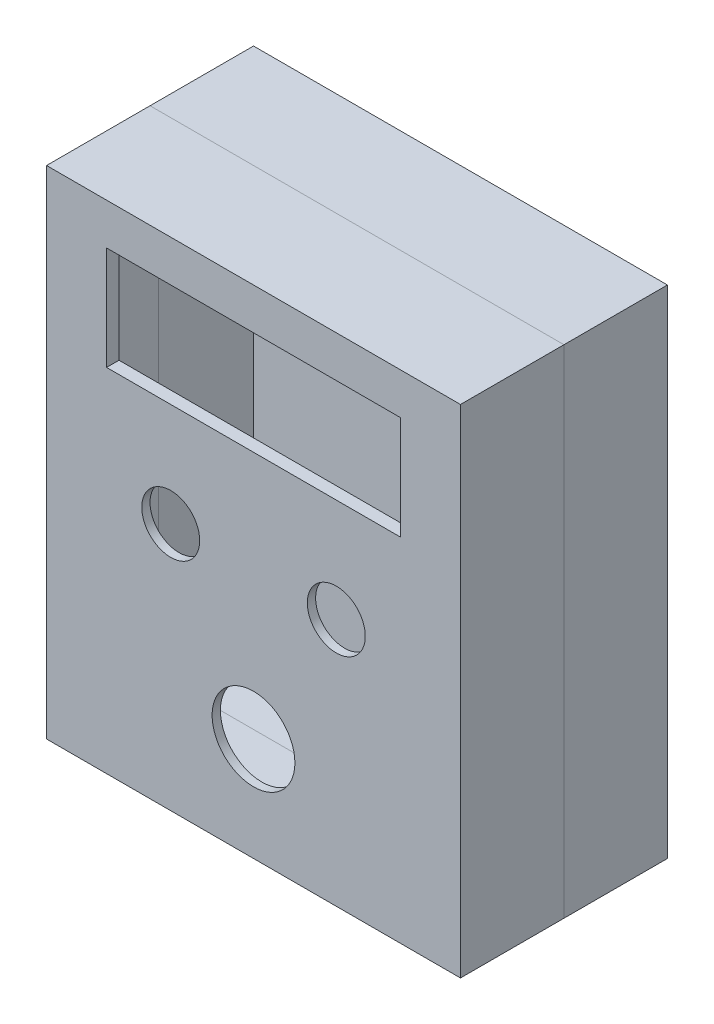
ISO-10303-21;
HEADER;
FILE_DESCRIPTION(('STEP AP214'),'2;1');
FILE_NAME('part.step','',(''),(''),'','','');
FILE_SCHEMA(('AUTOMOTIVE_DESIGN { 1 0 10303 214 1 1 1 1 }'));
ENDSEC;
DATA;
#1=APPLICATION_CONTEXT('core data for automotive mechanical design processes');
#2=APPLICATION_PROTOCOL_DEFINITION('international standard','automotive_design',2000,#1);
#3=PRODUCT_CONTEXT('',#1,'mechanical');
#4=PRODUCT('Part','Part','',(#3));
#5=PRODUCT_RELATED_PRODUCT_CATEGORY('part','',(#4));
#6=PRODUCT_DEFINITION_FORMATION('','',#4);
#7=PRODUCT_DEFINITION_CONTEXT('part definition',#1,'design');
#8=PRODUCT_DEFINITION('design','',#6,#7);
#9=PRODUCT_DEFINITION_SHAPE('','',#8);
#10=(LENGTH_UNIT() NAMED_UNIT(*) SI_UNIT(.MILLI.,.METRE.));
#11=(NAMED_UNIT(*) PLANE_ANGLE_UNIT() SI_UNIT($,.RADIAN.));
#12=(NAMED_UNIT(*) SI_UNIT($,.STERADIAN.) SOLID_ANGLE_UNIT());
#13=UNCERTAINTY_MEASURE_WITH_UNIT(LENGTH_MEASURE(1.E-05),#10,'distance_accuracy_value','');
#14=(GEOMETRIC_REPRESENTATION_CONTEXT(3) GLOBAL_UNCERTAINTY_ASSIGNED_CONTEXT((#13)) GLOBAL_UNIT_ASSIGNED_CONTEXT((#10,
#11,#12)) REPRESENTATION_CONTEXT('',''));
#15=CARTESIAN_POINT('',(0.,0.,0.));
#16=DIRECTION('',(0.,0.,1.));
#17=DIRECTION('',(1.,0.,0.));
#18=AXIS2_PLACEMENT_3D('',#15,#16,#17);
#19=CARTESIAN_POINT('',(0.,0.,0.));
#20=DIRECTION('',(0.,0.,1.));
#21=DIRECTION('',(1.,0.,0.));
#22=AXIS2_PLACEMENT_3D('',#19,#20,#21);
#23=PLANE('',#22);
#24=DIRECTION('',(1.,0.,0.));
#25=VECTOR('',#24,1.);
#26=CARTESIAN_POINT('',(100.,-60.,0.));
#27=LINE('',#26,#25);
#28=CARTESIAN_POINT('',(0.,-60.,0.));
#29=VERTEX_POINT('',#28);
#30=CARTESIAN_POINT('',(100.,-60.,0.));
#31=VERTEX_POINT('',#30);
#32=EDGE_CURVE('E170',#29,#31,#27,.T.);
#33=ORIENTED_EDGE('',*,*,#32,.T.);
#34=DIRECTION('',(0.,1.,0.));
#35=VECTOR('',#34,1.);
#36=CARTESIAN_POINT('',(100.,0.,0.));
#37=LINE('',#36,#35);
#38=CARTESIAN_POINT('',(100.,60.,0.));
#39=VERTEX_POINT('',#38);
#40=EDGE_CURVE('E166',#31,#39,#37,.T.);
#41=ORIENTED_EDGE('',*,*,#40,.T.);
#42=DIRECTION('',(-1.,0.,0.));
#43=VECTOR('',#42,1.);
#44=CARTESIAN_POINT('',(100.,60.,0.));
#45=LINE('',#44,#43);
#46=CARTESIAN_POINT('',(0.,60.,0.));
#47=VERTEX_POINT('',#46);
#48=EDGE_CURVE('E239',#39,#47,#45,.T.);
#49=ORIENTED_EDGE('',*,*,#48,.T.);
#50=DIRECTION('',(0.,1.,0.));
#51=VECTOR('',#50,1.);
#52=CARTESIAN_POINT('',(0.,0.,0.));
#53=LINE('',#52,#51);
#54=EDGE_CURVE('E161',#29,#47,#53,.T.);
#55=ORIENTED_EDGE('',*,*,#54,.F.);
#56=EDGE_LOOP('',(#33,#41,#49,#55));
#57=FACE_BOUND('',#56,.T.);
#58=DIRECTION('',(0.,1.,0.));
#59=VECTOR('',#58,1.);
#60=CARTESIAN_POINT('',(98.,0.,0.));
#61=LINE('',#60,#59);
#62=CARTESIAN_POINT('',(98.,-58.,0.));
#63=VERTEX_POINT('',#62);
#64=CARTESIAN_POINT('',(98.,58.,0.));
#65=VERTEX_POINT('',#64);
#66=EDGE_CURVE('E231',#63,#65,#61,.T.);
#67=ORIENTED_EDGE('',*,*,#66,.F.);
#68=DIRECTION('',(1.,0.,0.));
#69=VECTOR('',#68,1.);
#70=CARTESIAN_POINT('',(100.,-58.,0.));
#71=LINE('',#70,#69);
#72=CARTESIAN_POINT('',(2.,-58.,0.));
#73=VERTEX_POINT('',#72);
#74=EDGE_CURVE('E160',#73,#63,#71,.T.);
#75=ORIENTED_EDGE('',*,*,#74,.F.);
#76=DIRECTION('',(0.,1.,0.));
#77=VECTOR('',#76,1.);
#78=CARTESIAN_POINT('',(2.,0.,0.));
#79=LINE('',#78,#77);
#80=CARTESIAN_POINT('',(2.,58.,0.));
#81=VERTEX_POINT('',#80);
#82=EDGE_CURVE('E145',#73,#81,#79,.T.);
#83=ORIENTED_EDGE('',*,*,#82,.T.);
#84=DIRECTION('',(-1.,0.,0.));
#85=VECTOR('',#84,1.);
#86=CARTESIAN_POINT('',(100.,58.,0.));
#87=LINE('',#86,#85);
#88=EDGE_CURVE('E155',#65,#81,#87,.T.);
#89=ORIENTED_EDGE('',*,*,#88,.F.);
#90=EDGE_LOOP('',(#67,#75,#83,#89));
#91=FACE_BOUND('',#90,.T.);
#92=ADVANCED_FACE('F50',(#57,#91),#23,.T.);
#93=CARTESIAN_POINT('',(100.,60.,25.));
#94=DIRECTION('',(0.,-1.,0.));
#95=DIRECTION('',(0.,0.,-1.));
#96=AXIS2_PLACEMENT_3D('',#93,#94,#95);
#97=PLANE('',#96);
#98=ORIENTED_EDGE('',*,*,#48,.F.);
#99=DIRECTION('',(0.,0.,1.));
#100=VECTOR('',#99,1.);
#101=CARTESIAN_POINT('',(100.,60.,25.));
#102=LINE('',#101,#100);
#103=CARTESIAN_POINT('',(100.,60.,-25.));
#104=VERTEX_POINT('',#103);
#105=EDGE_CURVE('E177',#104,#39,#102,.T.);
#106=ORIENTED_EDGE('',*,*,#105,.F.);
#107=DIRECTION('',(-1.,0.,0.));
#108=VECTOR('',#107,1.);
#109=CARTESIAN_POINT('',(100.,60.,-25.));
#110=LINE('',#109,#108);
#111=CARTESIAN_POINT('',(0.,60.,-25.));
#112=VERTEX_POINT('',#111);
#113=EDGE_CURVE('E258',#104,#112,#110,.T.);
#114=ORIENTED_EDGE('',*,*,#113,.T.);
#115=DIRECTION('',(0.,0.,1.));
#116=VECTOR('',#115,1.);
#117=CARTESIAN_POINT('',(0.,60.,25.));
#118=LINE('',#117,#116);
#119=EDGE_CURVE('E185',#112,#47,#118,.T.);
#120=ORIENTED_EDGE('',*,*,#119,.T.);
#121=EDGE_LOOP('',(#98,#106,#114,#120));
#122=FACE_BOUND('',#121,.T.);
#123=ADVANCED_FACE('F257',(#122),#97,.F.);
#124=CARTESIAN_POINT('',(100.,-60.,25.));
#125=DIRECTION('',(0.,1.,0.));
#126=DIRECTION('',(0.,0.,1.));
#127=AXIS2_PLACEMENT_3D('',#124,#125,#126);
#128=PLANE('',#127);
#129=DIRECTION('',(-1.,0.,0.));
#130=VECTOR('',#129,1.);
#131=CARTESIAN_POINT('',(9.99999999999999,-60.,-11.));
#132=LINE('',#131,#130);
#133=CARTESIAN_POINT('',(90.,-60.,-11.));
#134=VERTEX_POINT('',#133);
#135=CARTESIAN_POINT('',(9.99999999999999,-60.,-11.));
#136=VERTEX_POINT('',#135);
#137=EDGE_CURVE('E60',#134,#136,#132,.T.);
#138=ORIENTED_EDGE('',*,*,#137,.F.);
#139=DIRECTION('',(0.,0.,1.));
#140=VECTOR('',#139,1.);
#141=CARTESIAN_POINT('',(90.,-60.,-11.));
#142=LINE('',#141,#140);
#143=CARTESIAN_POINT('',(90.,-60.,-21.));
#144=VERTEX_POINT('',#143);
#145=EDGE_CURVE('E12',#144,#134,#142,.T.);
#146=ORIENTED_EDGE('',*,*,#145,.F.);
#147=DIRECTION('',(1.,0.,0.));
#148=VECTOR('',#147,1.);
#149=CARTESIAN_POINT('',(10.,-60.,-21.));
#150=LINE('',#149,#148);
#151=CARTESIAN_POINT('',(10.,-60.,-21.));
#152=VERTEX_POINT('',#151);
#153=EDGE_CURVE('E217',#152,#144,#150,.T.);
#154=ORIENTED_EDGE('',*,*,#153,.F.);
#155=DIRECTION('',(0.,0.,-1.));
#156=VECTOR('',#155,1.);
#157=CARTESIAN_POINT('',(9.99999999999999,-60.,-11.));
#158=LINE('',#157,#156);
#159=EDGE_CURVE('E226',#136,#152,#158,.T.);
#160=ORIENTED_EDGE('',*,*,#159,.F.);
#161=EDGE_LOOP('',(#138,#146,#154,#160));
#162=FACE_BOUND('',#161,.T.);
#163=ORIENTED_EDGE('',*,*,#32,.F.);
#164=DIRECTION('',(0.,0.,-1.));
#165=VECTOR('',#164,1.);
#166=CARTESIAN_POINT('',(0.,-60.,25.));
#167=LINE('',#166,#165);
#168=CARTESIAN_POINT('',(0.,-60.,-25.));
#169=VERTEX_POINT('',#168);
#170=EDGE_CURVE('E182',#29,#169,#167,.T.);
#171=ORIENTED_EDGE('',*,*,#170,.T.);
#172=DIRECTION('',(-1.,0.,0.));
#173=VECTOR('',#172,1.);
#174=CARTESIAN_POINT('',(100.,-60.,-25.));
#175=LINE('',#174,#173);
#176=CARTESIAN_POINT('',(100.,-60.,-25.));
#177=VERTEX_POINT('',#176);
#178=EDGE_CURVE('E178',#177,#169,#175,.T.);
#179=ORIENTED_EDGE('',*,*,#178,.F.);
#180=DIRECTION('',(0.,0.,-1.));
#181=VECTOR('',#180,1.);
#182=CARTESIAN_POINT('',(100.,-60.,25.));
#183=LINE('',#182,#181);
#184=EDGE_CURVE('E174',#31,#177,#183,.T.);
#185=ORIENTED_EDGE('',*,*,#184,.F.);
#186=EDGE_LOOP('',(#163,#171,#179,#185));
#187=FACE_BOUND('',#186,.T.);
#188=ADVANCED_FACE('F264',(#162,#187),#128,.F.);
#189=CARTESIAN_POINT('',(100.,0.,0.));
#190=DIRECTION('',(-1.,0.,0.));
#191=DIRECTION('',(0.,0.,1.));
#192=AXIS2_PLACEMENT_3D('',#189,#190,#191);
#193=PLANE('',#192);
#194=ORIENTED_EDGE('',*,*,#40,.F.);
#195=ORIENTED_EDGE('',*,*,#184,.T.);
#196=DIRECTION('',(0.,1.,0.));
#197=VECTOR('',#196,1.);
#198=CARTESIAN_POINT('',(100.,-60.,-25.));
#199=LINE('',#198,#197);
#200=EDGE_CURVE('E181',#177,#104,#199,.T.);
#201=ORIENTED_EDGE('',*,*,#200,.T.);
#202=ORIENTED_EDGE('',*,*,#105,.T.);
#203=EDGE_LOOP('',(#194,#195,#201,#202));
#204=FACE_BOUND('',#203,.T.);
#205=ADVANCED_FACE('F52',(#204),#193,.F.);
#206=CARTESIAN_POINT('',(0.,0.,0.));
#207=DIRECTION('',(-1.,0.,0.));
#208=DIRECTION('',(0.,0.,1.));
#209=AXIS2_PLACEMENT_3D('',#206,#207,#208);
#210=PLANE('',#209);
#211=ORIENTED_EDGE('',*,*,#170,.F.);
#212=ORIENTED_EDGE('',*,*,#54,.T.);
#213=ORIENTED_EDGE('',*,*,#119,.F.);
#214=DIRECTION('',(0.,1.,0.));
#215=VECTOR('',#214,1.);
#216=CARTESIAN_POINT('',(0.,-60.,-25.));
#217=LINE('',#216,#215);
#218=EDGE_CURVE('E189',#169,#112,#217,.T.);
#219=ORIENTED_EDGE('',*,*,#218,.F.);
#220=EDGE_LOOP('',(#211,#212,#213,#219));
#221=FACE_BOUND('',#220,.T.);
#222=ADVANCED_FACE('F262',(#221),#210,.T.);
#223=CARTESIAN_POINT('',(100.,58.,25.));
#224=DIRECTION('',(0.,-1.,0.));
#225=DIRECTION('',(0.,0.,-1.));
#226=AXIS2_PLACEMENT_3D('',#223,#224,#225);
#227=PLANE('',#226);
#228=DIRECTION('',(0.,0.,1.));
#229=VECTOR('',#228,1.);
#230=CARTESIAN_POINT('',(98.,58.,0.));
#231=LINE('',#230,#229);
#232=CARTESIAN_POINT('',(98.,58.,-23.));
#233=VERTEX_POINT('',#232);
#234=EDGE_CURVE('E157',#233,#65,#231,.T.);
#235=ORIENTED_EDGE('',*,*,#234,.T.);
#236=ORIENTED_EDGE('',*,*,#88,.T.);
#237=DIRECTION('',(0.,0.,1.));
#238=VECTOR('',#237,1.);
#239=CARTESIAN_POINT('',(2.,58.,0.));
#240=LINE('',#239,#238);
#241=CARTESIAN_POINT('',(2.,58.,-23.));
#242=VERTEX_POINT('',#241);
#243=EDGE_CURVE('E54',#242,#81,#240,.T.);
#244=ORIENTED_EDGE('',*,*,#243,.F.);
#245=DIRECTION('',(-1.,0.,0.));
#246=VECTOR('',#245,1.);
#247=CARTESIAN_POINT('',(100.,58.,-23.));
#248=LINE('',#247,#246);
#249=EDGE_CURVE('E207',#233,#242,#248,.T.);
#250=ORIENTED_EDGE('',*,*,#249,.F.);
#251=EDGE_LOOP('',(#235,#236,#244,#250));
#252=FACE_BOUND('',#251,.T.);
#253=ADVANCED_FACE('F156',(#252),#227,.T.);
#254=CARTESIAN_POINT('',(100.,-58.,25.));
#255=DIRECTION('',(0.,1.,0.));
#256=DIRECTION('',(0.,0.,1.));
#257=AXIS2_PLACEMENT_3D('',#254,#255,#256);
#258=PLANE('',#257);
#259=DIRECTION('',(0.,0.,-1.));
#260=VECTOR('',#259,1.);
#261=CARTESIAN_POINT('',(90.,-58.,25.));
#262=LINE('',#261,#260);
#263=CARTESIAN_POINT('',(90.,-58.,-11.));
#264=VERTEX_POINT('',#263);
#265=CARTESIAN_POINT('',(90.,-58.,-21.));
#266=VERTEX_POINT('',#265);
#267=EDGE_CURVE('E234',#264,#266,#262,.T.);
#268=ORIENTED_EDGE('',*,*,#267,.F.);
#269=DIRECTION('',(1.,0.,0.));
#270=VECTOR('',#269,1.);
#271=CARTESIAN_POINT('',(100.,-58.,-11.));
#272=LINE('',#271,#270);
#273=CARTESIAN_POINT('',(9.99999999999999,-58.,-11.));
#274=VERTEX_POINT('',#273);
#275=EDGE_CURVE('E270',#274,#264,#272,.T.);
#276=ORIENTED_EDGE('',*,*,#275,.F.);
#277=DIRECTION('',(0.,0.,1.));
#278=VECTOR('',#277,1.);
#279=CARTESIAN_POINT('',(9.99999999999999,-58.,25.));
#280=LINE('',#279,#278);
#281=CARTESIAN_POINT('',(10.,-58.,-21.));
#282=VERTEX_POINT('',#281);
#283=EDGE_CURVE('E415',#282,#274,#280,.T.);
#284=ORIENTED_EDGE('',*,*,#283,.F.);
#285=DIRECTION('',(-1.,0.,0.));
#286=VECTOR('',#285,1.);
#287=CARTESIAN_POINT('',(100.,-58.,-21.));
#288=LINE('',#287,#286);
#289=EDGE_CURVE('E409',#266,#282,#288,.T.);
#290=ORIENTED_EDGE('',*,*,#289,.F.);
#291=EDGE_LOOP('',(#268,#276,#284,#290));
#292=FACE_BOUND('',#291,.T.);
#293=DIRECTION('',(0.,0.,-1.));
#294=VECTOR('',#293,1.);
#295=CARTESIAN_POINT('',(2.,-58.,0.));
#296=LINE('',#295,#294);
#297=CARTESIAN_POINT('',(2.,-58.,-23.));
#298=VERTEX_POINT('',#297);
#299=EDGE_CURVE('E152',#73,#298,#296,.T.);
#300=ORIENTED_EDGE('',*,*,#299,.F.);
#301=ORIENTED_EDGE('',*,*,#74,.T.);
#302=DIRECTION('',(0.,0.,-1.));
#303=VECTOR('',#302,1.);
#304=CARTESIAN_POINT('',(98.,-58.,0.));
#305=LINE('',#304,#303);
#306=CARTESIAN_POINT('',(98.,-58.,-23.));
#307=VERTEX_POINT('',#306);
#308=EDGE_CURVE('E190',#63,#307,#305,.T.);
#309=ORIENTED_EDGE('',*,*,#308,.T.);
#310=DIRECTION('',(-1.,0.,0.));
#311=VECTOR('',#310,1.);
#312=CARTESIAN_POINT('',(100.,-58.,-23.));
#313=LINE('',#312,#311);
#314=EDGE_CURVE('E193',#307,#298,#313,.T.);
#315=ORIENTED_EDGE('',*,*,#314,.T.);
#316=EDGE_LOOP('',(#300,#301,#309,#315));
#317=FACE_BOUND('',#316,.T.);
#318=ADVANCED_FACE('F278',(#292,#317),#258,.T.);
#319=CARTESIAN_POINT('',(98.,0.,0.));
#320=DIRECTION('',(-1.,0.,0.));
#321=DIRECTION('',(0.,0.,1.));
#322=AXIS2_PLACEMENT_3D('',#319,#320,#321);
#323=PLANE('',#322);
#324=ORIENTED_EDGE('',*,*,#308,.F.);
#325=ORIENTED_EDGE('',*,*,#66,.T.);
#326=ORIENTED_EDGE('',*,*,#234,.F.);
#327=DIRECTION('',(0.,1.,0.));
#328=VECTOR('',#327,1.);
#329=CARTESIAN_POINT('',(98.,0.,-23.));
#330=LINE('',#329,#328);
#331=EDGE_CURVE('E195',#307,#233,#330,.T.);
#332=ORIENTED_EDGE('',*,*,#331,.F.);
#333=EDGE_LOOP('',(#324,#325,#326,#332));
#334=FACE_BOUND('',#333,.T.);
#335=ADVANCED_FACE('F303',(#334),#323,.T.);
#336=CARTESIAN_POINT('',(2.,0.,0.));
#337=DIRECTION('',(-1.,0.,0.));
#338=DIRECTION('',(0.,0.,1.));
#339=AXIS2_PLACEMENT_3D('',#336,#337,#338);
#340=PLANE('',#339);
#341=ORIENTED_EDGE('',*,*,#82,.F.);
#342=ORIENTED_EDGE('',*,*,#299,.T.);
#343=DIRECTION('',(0.,1.,0.));
#344=VECTOR('',#343,1.);
#345=CARTESIAN_POINT('',(2.,0.,-23.));
#346=LINE('',#345,#344);
#347=EDGE_CURVE('E147',#298,#242,#346,.T.);
#348=ORIENTED_EDGE('',*,*,#347,.T.);
#349=ORIENTED_EDGE('',*,*,#243,.T.);
#350=EDGE_LOOP('',(#341,#342,#348,#349));
#351=FACE_BOUND('',#350,.T.);
#352=ADVANCED_FACE('F143',(#351),#340,.F.);
#353=CARTESIAN_POINT('',(100.,-60.,-25.));
#354=DIRECTION('',(0.,0.,1.));
#355=DIRECTION('',(1.,0.,0.));
#356=AXIS2_PLACEMENT_3D('',#353,#354,#355);
#357=PLANE('',#356);
#358=ORIENTED_EDGE('',*,*,#218,.T.);
#359=ORIENTED_EDGE('',*,*,#113,.F.);
#360=ORIENTED_EDGE('',*,*,#200,.F.);
#361=ORIENTED_EDGE('',*,*,#178,.T.);
#362=EDGE_LOOP('',(#358,#359,#360,#361));
#363=FACE_BOUND('',#362,.T.);
#364=ADVANCED_FACE('F266',(#363),#357,.F.);
#365=CARTESIAN_POINT('',(100.,-60.,-23.));
#366=DIRECTION('',(0.,0.,1.));
#367=DIRECTION('',(1.,0.,0.));
#368=AXIS2_PLACEMENT_3D('',#365,#366,#367);
#369=PLANE('',#368);
#370=ORIENTED_EDGE('',*,*,#347,.F.);
#371=ORIENTED_EDGE('',*,*,#314,.F.);
#372=ORIENTED_EDGE('',*,*,#331,.T.);
#373=ORIENTED_EDGE('',*,*,#249,.T.);
#374=EDGE_LOOP('',(#370,#371,#372,#373));
#375=FACE_BOUND('',#374,.T.);
#376=ADVANCED_FACE('F280',(#375),#369,.T.);
#377=CARTESIAN_POINT('',(90.,-57.,-11.));
#378=DIRECTION('',(1.,0.,0.));
#379=DIRECTION('',(0.,0.,-1.));
#380=AXIS2_PLACEMENT_3D('',#377,#378,#379);
#381=PLANE('',#380);
#382=ORIENTED_EDGE('',*,*,#267,.T.);
#383=DIRECTION('',(0.,-1.,0.));
#384=VECTOR('',#383,1.);
#385=CARTESIAN_POINT('',(90.,-57.,-21.));
#386=LINE('',#385,#384);
#387=EDGE_CURVE('E212',#266,#144,#386,.T.);
#388=ORIENTED_EDGE('',*,*,#387,.T.);
#389=ORIENTED_EDGE('',*,*,#145,.T.);
#390=DIRECTION('',(0.,-1.,0.));
#391=VECTOR('',#390,1.);
#392=CARTESIAN_POINT('',(90.,-57.,-11.));
#393=LINE('',#392,#391);
#394=EDGE_CURVE('E213',#264,#134,#393,.T.);
#395=ORIENTED_EDGE('',*,*,#394,.F.);
#396=EDGE_LOOP('',(#382,#388,#389,#395));
#397=FACE_BOUND('',#396,.T.);
#398=ADVANCED_FACE('F282',(#397),#381,.F.);
#399=CARTESIAN_POINT('',(10.,-57.,-21.));
#400=DIRECTION('',(0.,0.,-1.));
#401=DIRECTION('',(-1.,0.,0.));
#402=AXIS2_PLACEMENT_3D('',#399,#400,#401);
#403=PLANE('',#402);
#404=ORIENTED_EDGE('',*,*,#289,.T.);
#405=DIRECTION('',(0.,-1.,0.));
#406=VECTOR('',#405,1.);
#407=CARTESIAN_POINT('',(10.,-57.,-21.));
#408=LINE('',#407,#406);
#409=EDGE_CURVE('E76',#282,#152,#408,.T.);
#410=ORIENTED_EDGE('',*,*,#409,.T.);
#411=ORIENTED_EDGE('',*,*,#153,.T.);
#412=ORIENTED_EDGE('',*,*,#387,.F.);
#413=EDGE_LOOP('',(#404,#410,#411,#412));
#414=FACE_BOUND('',#413,.T.);
#415=ADVANCED_FACE('F288',(#414),#403,.F.);
#416=CARTESIAN_POINT('',(9.99999999999999,-57.,-11.));
#417=DIRECTION('',(-1.,0.,0.));
#418=DIRECTION('',(0.,0.,1.));
#419=AXIS2_PLACEMENT_3D('',#416,#417,#418);
#420=PLANE('',#419);
#421=ORIENTED_EDGE('',*,*,#283,.T.);
#422=DIRECTION('',(0.,-1.,0.));
#423=VECTOR('',#422,1.);
#424=CARTESIAN_POINT('',(9.99999999999999,-57.,-11.));
#425=LINE('',#424,#423);
#426=EDGE_CURVE('E68',#274,#136,#425,.T.);
#427=ORIENTED_EDGE('',*,*,#426,.T.);
#428=ORIENTED_EDGE('',*,*,#159,.T.);
#429=ORIENTED_EDGE('',*,*,#409,.F.);
#430=EDGE_LOOP('',(#421,#427,#428,#429));
#431=FACE_BOUND('',#430,.T.);
#432=ADVANCED_FACE('F337',(#431),#420,.F.);
#433=CARTESIAN_POINT('',(9.99999999999999,-57.,-11.));
#434=DIRECTION('',(0.,0.,1.));
#435=DIRECTION('',(1.,0.,0.));
#436=AXIS2_PLACEMENT_3D('',#433,#434,#435);
#437=PLANE('',#436);
#438=ORIENTED_EDGE('',*,*,#275,.T.);
#439=ORIENTED_EDGE('',*,*,#394,.T.);
#440=ORIENTED_EDGE('',*,*,#137,.T.);
#441=ORIENTED_EDGE('',*,*,#426,.F.);
#442=EDGE_LOOP('',(#438,#439,#440,#441));
#443=FACE_BOUND('',#442,.T.);
#444=ADVANCED_FACE('F301',(#443),#437,.F.);
#445=CLOSED_SHELL('',(#92,#123,#188,#205,#222,#253,#318,#335,#352,#364,#376,#398,#415,#432,#444));
#446=MANIFOLD_SOLID_BREP('B2',#445);
#447=CARTESIAN_POINT('',(0.,0.,0.));
#448=DIRECTION('',(0.,0.,1.));
#449=DIRECTION('',(1.,0.,0.));
#450=AXIS2_PLACEMENT_3D('',#447,#448,#449);
#451=PLANE('',#450);
#452=DIRECTION('',(0.,1.,0.));
#453=VECTOR('',#452,1.);
#454=CARTESIAN_POINT('',(98.,0.,0.));
#455=LINE('',#454,#453);
#456=CARTESIAN_POINT('',(98.,-58.,0.));
#457=VERTEX_POINT('',#456);
#458=CARTESIAN_POINT('',(98.,58.,0.));
#459=VERTEX_POINT('',#458);
#460=EDGE_CURVE('E48',#457,#459,#455,.T.);
#461=ORIENTED_EDGE('',*,*,#460,.T.);
#462=DIRECTION('',(-1.,0.,0.));
#463=VECTOR('',#462,1.);
#464=CARTESIAN_POINT('',(100.,58.,0.));
#465=LINE('',#464,#463);
#466=CARTESIAN_POINT('',(2.,58.,0.));
#467=VERTEX_POINT('',#466);
#468=EDGE_CURVE('E452',#459,#467,#465,.T.);
#469=ORIENTED_EDGE('',*,*,#468,.T.);
#470=DIRECTION('',(0.,1.,0.));
#471=VECTOR('',#470,1.);
#472=CARTESIAN_POINT('',(2.,0.,0.));
#473=LINE('',#472,#471);
#474=CARTESIAN_POINT('',(2.,-58.,0.));
#475=VERTEX_POINT('',#474);
#476=EDGE_CURVE('E548',#475,#467,#473,.T.);
#477=ORIENTED_EDGE('',*,*,#476,.F.);
#478=DIRECTION('',(1.,0.,0.));
#479=VECTOR('',#478,1.);
#480=CARTESIAN_POINT('',(100.,-58.,0.));
#481=LINE('',#480,#479);
#482=EDGE_CURVE('E438',#475,#457,#481,.T.);
#483=ORIENTED_EDGE('',*,*,#482,.T.);
#484=EDGE_LOOP('',(#461,#469,#477,#483));
#485=FACE_BOUND('',#484,.T.);
#486=DIRECTION('',(1.,0.,0.));
#487=VECTOR('',#486,1.);
#488=CARTESIAN_POINT('',(100.,-60.,0.));
#489=LINE('',#488,#487);
#490=CARTESIAN_POINT('',(0.,-60.,0.));
#491=VERTEX_POINT('',#490);
#492=CARTESIAN_POINT('',(100.,-60.,0.));
#493=VERTEX_POINT('',#492);
#494=EDGE_CURVE('E664',#491,#493,#489,.T.);
#495=ORIENTED_EDGE('',*,*,#494,.F.);
#496=DIRECTION('',(0.,1.,0.));
#497=VECTOR('',#496,1.);
#498=CARTESIAN_POINT('',(0.,0.,0.));
#499=LINE('',#498,#497);
#500=CARTESIAN_POINT('',(0.,60.,0.));
#501=VERTEX_POINT('',#500);
#502=EDGE_CURVE('E659',#491,#501,#499,.T.);
#503=ORIENTED_EDGE('',*,*,#502,.T.);
#504=DIRECTION('',(-1.,0.,0.));
#505=VECTOR('',#504,1.);
#506=CARTESIAN_POINT('',(100.,60.,0.));
#507=LINE('',#506,#505);
#508=CARTESIAN_POINT('',(100.,60.,0.));
#509=VERTEX_POINT('',#508);
#510=EDGE_CURVE('E663',#509,#501,#507,.T.);
#511=ORIENTED_EDGE('',*,*,#510,.F.);
#512=DIRECTION('',(0.,1.,0.));
#513=VECTOR('',#512,1.);
#514=CARTESIAN_POINT('',(100.,0.,0.));
#515=LINE('',#514,#513);
#516=EDGE_CURVE('E433',#493,#509,#515,.T.);
#517=ORIENTED_EDGE('',*,*,#516,.F.);
#518=EDGE_LOOP('',(#495,#503,#511,#517));
#519=FACE_BOUND('',#518,.T.);
#520=ADVANCED_FACE('F430',(#485,#519),#451,.F.);
#521=CARTESIAN_POINT('',(0.,0.,22.));
#522=DIRECTION('',(0.,0.,-1.));
#523=DIRECTION('',(-1.,0.,0.));
#524=AXIS2_PLACEMENT_3D('',#521,#522,#523);
#525=PLANE('',#524);
#526=DIRECTION('',(0.,1.,0.));
#527=VECTOR('',#526,1.);
#528=CARTESIAN_POINT('',(87.5,25.,22.));
#529=LINE('',#528,#527);
#530=CARTESIAN_POINT('',(87.5,23.,22.));
#531=VERTEX_POINT('',#530);
#532=CARTESIAN_POINT('',(87.5,52.,22.));
#533=VERTEX_POINT('',#532);
#534=EDGE_CURVE('E586',#531,#533,#529,.T.);
#535=ORIENTED_EDGE('',*,*,#534,.F.);
#536=DIRECTION('',(1.,0.,0.));
#537=VECTOR('',#536,1.);
#538=CARTESIAN_POINT('',(14.5,23.,22.));
#539=LINE('',#538,#537);
#540=CARTESIAN_POINT('',(12.5,23.,22.));
#541=VERTEX_POINT('',#540);
#542=EDGE_CURVE('E581',#541,#531,#539,.T.);
#543=ORIENTED_EDGE('',*,*,#542,.F.);
#544=DIRECTION('',(0.,-1.,0.));
#545=VECTOR('',#544,1.);
#546=CARTESIAN_POINT('',(12.5,25.,22.));
#547=LINE('',#546,#545);
#548=CARTESIAN_POINT('',(12.5,52.,22.));
#549=VERTEX_POINT('',#548);
#550=EDGE_CURVE('E593',#549,#541,#547,.T.);
#551=ORIENTED_EDGE('',*,*,#550,.F.);
#552=DIRECTION('',(-1.,0.,0.));
#553=VECTOR('',#552,1.);
#554=CARTESIAN_POINT('',(14.5,52.,22.));
#555=LINE('',#554,#553);
#556=EDGE_CURVE('E589',#533,#549,#555,.T.);
#557=ORIENTED_EDGE('',*,*,#556,.F.);
#558=EDGE_LOOP('',(#535,#543,#551,#557));
#559=FACE_BOUND('',#558,.T.);
#560=DIRECTION('',(0.,1.,0.));
#561=VECTOR('',#560,1.);
#562=CARTESIAN_POINT('',(85.5,25.,22.));
#563=LINE('',#562,#561);
#564=CARTESIAN_POINT('',(85.5,25.,22.));
#565=VERTEX_POINT('',#564);
#566=CARTESIAN_POINT('',(85.5,50.,22.));
#567=VERTEX_POINT('',#566);
#568=EDGE_CURVE('E598',#565,#567,#563,.T.);
#569=ORIENTED_EDGE('',*,*,#568,.T.);
#570=DIRECTION('',(-1.,0.,0.));
#571=VECTOR('',#570,1.);
#572=CARTESIAN_POINT('',(14.5,50.,22.));
#573=LINE('',#572,#571);
#574=CARTESIAN_POINT('',(14.5,50.,22.));
#575=VERTEX_POINT('',#574);
#576=EDGE_CURVE('E600',#567,#575,#573,.T.);
#577=ORIENTED_EDGE('',*,*,#576,.T.);
#578=DIRECTION('',(0.,-1.,0.));
#579=VECTOR('',#578,1.);
#580=CARTESIAN_POINT('',(14.5,25.,22.));
#581=LINE('',#580,#579);
#582=CARTESIAN_POINT('',(14.5,25.,22.));
#583=VERTEX_POINT('',#582);
#584=EDGE_CURVE('E603',#575,#583,#581,.T.);
#585=ORIENTED_EDGE('',*,*,#584,.T.);
#586=DIRECTION('',(1.,0.,0.));
#587=VECTOR('',#586,1.);
#588=CARTESIAN_POINT('',(14.5,25.,22.));
#589=LINE('',#588,#587);
#590=EDGE_CURVE('E605',#583,#565,#589,.T.);
#591=ORIENTED_EDGE('',*,*,#590,.T.);
#592=EDGE_LOOP('',(#569,#577,#585,#591));
#593=FACE_BOUND('',#592,.T.);
#594=ADVANCED_FACE('F695',(#559,#593),#525,.T.);
#595=CARTESIAN_POINT('',(14.5,25.,22.));
#596=DIRECTION('',(-1.,0.,0.));
#597=DIRECTION('',(0.,0.,1.));
#598=AXIS2_PLACEMENT_3D('',#595,#596,#597);
#599=PLANE('',#598);
#600=DIRECTION('',(0.,-1.,0.));
#601=VECTOR('',#600,1.);
#602=CARTESIAN_POINT('',(14.5,25.,25.));
#603=LINE('',#602,#601);
#604=CARTESIAN_POINT('',(14.5,50.,25.));
#605=VERTEX_POINT('',#604);
#606=CARTESIAN_POINT('',(14.5,25.,25.));
#607=VERTEX_POINT('',#606);
#608=EDGE_CURVE('E612',#605,#607,#603,.T.);
#609=ORIENTED_EDGE('',*,*,#608,.T.);
#610=DIRECTION('',(0.,0.,1.));
#611=VECTOR('',#610,1.);
#612=CARTESIAN_POINT('',(14.5,25.,22.));
#613=LINE('',#612,#611);
#614=EDGE_CURVE('E620',#583,#607,#613,.T.);
#615=ORIENTED_EDGE('',*,*,#614,.F.);
#616=ORIENTED_EDGE('',*,*,#584,.F.);
#617=DIRECTION('',(0.,0.,1.));
#618=VECTOR('',#617,1.);
#619=CARTESIAN_POINT('',(14.5,50.,22.));
#620=LINE('',#619,#618);
#621=EDGE_CURVE('E622',#575,#605,#620,.T.);
#622=ORIENTED_EDGE('',*,*,#621,.T.);
#623=EDGE_LOOP('',(#609,#615,#616,#622));
#624=FACE_BOUND('',#623,.T.);
#625=ADVANCED_FACE('F699',(#624),#599,.F.);
#626=CARTESIAN_POINT('',(14.5,25.,22.));
#627=DIRECTION('',(0.,-1.,0.));
#628=DIRECTION('',(0.,0.,-1.));
#629=AXIS2_PLACEMENT_3D('',#626,#627,#628);
#630=PLANE('',#629);
#631=DIRECTION('',(1.,0.,0.));
#632=VECTOR('',#631,1.);
#633=CARTESIAN_POINT('',(14.5,25.,25.));
#634=LINE('',#633,#632);
#635=CARTESIAN_POINT('',(85.5,25.,25.));
#636=VERTEX_POINT('',#635);
#637=EDGE_CURVE('E601',#607,#636,#634,.T.);
#638=ORIENTED_EDGE('',*,*,#637,.T.);
#639=DIRECTION('',(0.,0.,1.));
#640=VECTOR('',#639,1.);
#641=CARTESIAN_POINT('',(85.5,25.,22.));
#642=LINE('',#641,#640);
#643=EDGE_CURVE('E617',#565,#636,#642,.T.);
#644=ORIENTED_EDGE('',*,*,#643,.F.);
#645=ORIENTED_EDGE('',*,*,#590,.F.);
#646=ORIENTED_EDGE('',*,*,#614,.T.);
#647=EDGE_LOOP('',(#638,#644,#645,#646));
#648=FACE_BOUND('',#647,.T.);
#649=ADVANCED_FACE('F741',(#648),#630,.F.);
#650=CARTESIAN_POINT('',(85.5,25.,22.));
#651=DIRECTION('',(1.,0.,0.));
#652=DIRECTION('',(0.,0.,-1.));
#653=AXIS2_PLACEMENT_3D('',#650,#651,#652);
#654=PLANE('',#653);
#655=DIRECTION('',(0.,1.,0.));
#656=VECTOR('',#655,1.);
#657=CARTESIAN_POINT('',(85.5,25.,25.));
#658=LINE('',#657,#656);
#659=CARTESIAN_POINT('',(85.5,50.,25.));
#660=VERTEX_POINT('',#659);
#661=EDGE_CURVE('E558',#636,#660,#658,.T.);
#662=ORIENTED_EDGE('',*,*,#661,.T.);
#663=DIRECTION('',(0.,0.,1.));
#664=VECTOR('',#663,1.);
#665=CARTESIAN_POINT('',(85.5,50.,22.));
#666=LINE('',#665,#664);
#667=EDGE_CURVE('E607',#567,#660,#666,.T.);
#668=ORIENTED_EDGE('',*,*,#667,.F.);
#669=ORIENTED_EDGE('',*,*,#568,.F.);
#670=ORIENTED_EDGE('',*,*,#643,.T.);
#671=EDGE_LOOP('',(#662,#668,#669,#670));
#672=FACE_BOUND('',#671,.T.);
#673=ADVANCED_FACE('F744',(#672),#654,.F.);
#674=CARTESIAN_POINT('',(14.5,50.,22.));
#675=DIRECTION('',(0.,1.,0.));
#676=DIRECTION('',(0.,0.,1.));
#677=AXIS2_PLACEMENT_3D('',#674,#675,#676);
#678=PLANE('',#677);
#679=DIRECTION('',(-1.,0.,0.));
#680=VECTOR('',#679,1.);
#681=CARTESIAN_POINT('',(14.5,50.,25.));
#682=LINE('',#681,#680);
#683=EDGE_CURVE('E609',#660,#605,#682,.T.);
#684=ORIENTED_EDGE('',*,*,#683,.T.);
#685=ORIENTED_EDGE('',*,*,#621,.F.);
#686=ORIENTED_EDGE('',*,*,#576,.F.);
#687=ORIENTED_EDGE('',*,*,#667,.T.);
#688=EDGE_LOOP('',(#684,#685,#686,#687));
#689=FACE_BOUND('',#688,.T.);
#690=ADVANCED_FACE('F749',(#689),#678,.F.);
#691=CARTESIAN_POINT('',(87.5,25.,22.));
#692=DIRECTION('',(1.,0.,0.));
#693=DIRECTION('',(0.,0.,-1.));
#694=AXIS2_PLACEMENT_3D('',#691,#692,#693);
#695=PLANE('',#694);
#696=DIRECTION('',(0.,1.,0.));
#697=VECTOR('',#696,1.);
#698=CARTESIAN_POINT('',(87.5,25.,23.));
#699=LINE('',#698,#697);
#700=CARTESIAN_POINT('',(87.5,23.,23.));
#701=VERTEX_POINT('',#700);
#702=CARTESIAN_POINT('',(87.5,52.,23.));
#703=VERTEX_POINT('',#702);
#704=EDGE_CURVE('E648',#701,#703,#699,.T.);
#705=ORIENTED_EDGE('',*,*,#704,.F.);
#706=DIRECTION('',(0.,0.,1.));
#707=VECTOR('',#706,1.);
#708=CARTESIAN_POINT('',(87.5,23.,22.));
#709=LINE('',#708,#707);
#710=EDGE_CURVE('E549',#531,#701,#709,.T.);
#711=ORIENTED_EDGE('',*,*,#710,.F.);
#712=ORIENTED_EDGE('',*,*,#534,.T.);
#713=DIRECTION('',(0.,0.,1.));
#714=VECTOR('',#713,1.);
#715=CARTESIAN_POINT('',(87.5,52.,22.));
#716=LINE('',#715,#714);
#717=EDGE_CURVE('E577',#533,#703,#716,.T.);
#718=ORIENTED_EDGE('',*,*,#717,.T.);
#719=EDGE_LOOP('',(#705,#711,#712,#718));
#720=FACE_BOUND('',#719,.T.);
#721=ADVANCED_FACE('F723',(#720),#695,.T.);
#722=CARTESIAN_POINT('',(14.5,23.,22.));
#723=DIRECTION('',(0.,-1.,0.));
#724=DIRECTION('',(0.,0.,-1.));
#725=AXIS2_PLACEMENT_3D('',#722,#723,#724);
#726=PLANE('',#725);
#727=DIRECTION('',(1.,0.,0.));
#728=VECTOR('',#727,1.);
#729=CARTESIAN_POINT('',(14.5,23.,23.));
#730=LINE('',#729,#728);
#731=CARTESIAN_POINT('',(12.5,23.,23.));
#732=VERTEX_POINT('',#731);
#733=EDGE_CURVE('E590',#732,#701,#730,.T.);
#734=ORIENTED_EDGE('',*,*,#733,.F.);
#735=DIRECTION('',(0.,0.,1.));
#736=VECTOR('',#735,1.);
#737=CARTESIAN_POINT('',(12.5,23.,22.));
#738=LINE('',#737,#736);
#739=EDGE_CURVE('E583',#541,#732,#738,.T.);
#740=ORIENTED_EDGE('',*,*,#739,.F.);
#741=ORIENTED_EDGE('',*,*,#542,.T.);
#742=ORIENTED_EDGE('',*,*,#710,.T.);
#743=EDGE_LOOP('',(#734,#740,#741,#742));
#744=FACE_BOUND('',#743,.T.);
#745=ADVANCED_FACE('F719',(#744),#726,.T.);
#746=CARTESIAN_POINT('',(12.5,25.,22.));
#747=DIRECTION('',(-1.,0.,0.));
#748=DIRECTION('',(0.,0.,1.));
#749=AXIS2_PLACEMENT_3D('',#746,#747,#748);
#750=PLANE('',#749);
#751=DIRECTION('',(0.,-1.,0.));
#752=VECTOR('',#751,1.);
#753=CARTESIAN_POINT('',(12.5,25.,23.));
#754=LINE('',#753,#752);
#755=CARTESIAN_POINT('',(12.5,52.,23.));
#756=VERTEX_POINT('',#755);
#757=EDGE_CURVE('E569',#756,#732,#754,.T.);
#758=ORIENTED_EDGE('',*,*,#757,.F.);
#759=DIRECTION('',(0.,0.,1.));
#760=VECTOR('',#759,1.);
#761=CARTESIAN_POINT('',(12.5,52.,22.));
#762=LINE('',#761,#760);
#763=EDGE_CURVE('E580',#549,#756,#762,.T.);
#764=ORIENTED_EDGE('',*,*,#763,.F.);
#765=ORIENTED_EDGE('',*,*,#550,.T.);
#766=ORIENTED_EDGE('',*,*,#739,.T.);
#767=EDGE_LOOP('',(#758,#764,#765,#766));
#768=FACE_BOUND('',#767,.T.);
#769=ADVANCED_FACE('F729',(#768),#750,.T.);
#770=CARTESIAN_POINT('',(14.5,52.,22.));
#771=DIRECTION('',(0.,1.,0.));
#772=DIRECTION('',(0.,0.,1.));
#773=AXIS2_PLACEMENT_3D('',#770,#771,#772);
#774=PLANE('',#773);
#775=DIRECTION('',(-1.,0.,0.));
#776=VECTOR('',#775,1.);
#777=CARTESIAN_POINT('',(14.5,52.,23.));
#778=LINE('',#777,#776);
#779=EDGE_CURVE('E707',#703,#756,#778,.T.);
#780=ORIENTED_EDGE('',*,*,#779,.F.);
#781=ORIENTED_EDGE('',*,*,#717,.F.);
#782=ORIENTED_EDGE('',*,*,#556,.T.);
#783=ORIENTED_EDGE('',*,*,#763,.T.);
#784=EDGE_LOOP('',(#780,#781,#782,#783));
#785=FACE_BOUND('',#784,.T.);
#786=ADVANCED_FACE('F728',(#785),#774,.T.);
#787=CARTESIAN_POINT('',(50.,-35.,22.));
#788=DIRECTION('',(0.,0.,1.));
#789=DIRECTION('',(1.,0.,0.));
#790=AXIS2_PLACEMENT_3D('',#787,#788,#789);
#791=CYLINDRICAL_SURFACE('',#790,10.);
#792=CARTESIAN_POINT('',(50.,-35.,23.));
#793=DIRECTION('',(0.,0.,-1.));
#794=DIRECTION('',(-1.,0.,0.));
#795=AXIS2_PLACEMENT_3D('',#792,#793,#794);
#796=CIRCLE('',#795,10.);
#797=CARTESIAN_POINT('',(40.,-35.,23.));
#798=VERTEX_POINT('',#797);
#799=EDGE_CURVE('E645',#798,#798,#796,.T.);
#800=ORIENTED_EDGE('',*,*,#799,.T.);
#801=EDGE_LOOP('',(#800));
#802=FACE_BOUND('',#801,.T.);
#803=CARTESIAN_POINT('',(50.,-35.,25.));
#804=DIRECTION('',(0.,0.,1.));
#805=DIRECTION('',(1.,0.,0.));
#806=AXIS2_PLACEMENT_3D('',#803,#804,#805);
#807=CIRCLE('',#806,10.);
#808=CARTESIAN_POINT('',(60.,-35.,25.));
#809=VERTEX_POINT('',#808);
#810=EDGE_CURVE('E649',#809,#809,#807,.T.);
#811=ORIENTED_EDGE('',*,*,#810,.T.);
#812=EDGE_LOOP('',(#811));
#813=FACE_BOUND('',#812,.T.);
#814=ADVANCED_FACE('F736',(#802,#813),#791,.F.);
#815=CARTESIAN_POINT('',(70.,0.,22.));
#816=DIRECTION('',(0.,0.,1.));
#817=DIRECTION('',(1.,0.,0.));
#818=AXIS2_PLACEMENT_3D('',#815,#816,#817);
#819=CYLINDRICAL_SURFACE('',#818,7.);
#820=CARTESIAN_POINT('',(70.,0.,23.));
#821=DIRECTION('',(0.,0.,-1.));
#822=DIRECTION('',(-1.,0.,0.));
#823=AXIS2_PLACEMENT_3D('',#820,#821,#822);
#824=CIRCLE('',#823,7.);
#825=CARTESIAN_POINT('',(63.,0.,23.));
#826=VERTEX_POINT('',#825);
#827=EDGE_CURVE('E650',#826,#826,#824,.T.);
#828=ORIENTED_EDGE('',*,*,#827,.T.);
#829=EDGE_LOOP('',(#828));
#830=FACE_BOUND('',#829,.T.);
#831=CARTESIAN_POINT('',(70.,0.,25.));
#832=DIRECTION('',(0.,0.,1.));
#833=DIRECTION('',(-1.,0.,0.));
#834=AXIS2_PLACEMENT_3D('',#831,#832,#833);
#835=CIRCLE('',#834,7.);
#836=CARTESIAN_POINT('',(63.,0.,25.));
#837=VERTEX_POINT('',#836);
#838=EDGE_CURVE('E783',#837,#837,#835,.T.);
#839=ORIENTED_EDGE('',*,*,#838,.T.);
#840=EDGE_LOOP('',(#839));
#841=FACE_BOUND('',#840,.T.);
#842=ADVANCED_FACE('F793',(#830,#841),#819,.F.);
#843=CARTESIAN_POINT('',(30.,0.,22.));
#844=DIRECTION('',(0.,0.,1.));
#845=DIRECTION('',(1.,0.,0.));
#846=AXIS2_PLACEMENT_3D('',#843,#844,#845);
#847=CYLINDRICAL_SURFACE('',#846,7.);
#848=CARTESIAN_POINT('',(30.,0.,23.));
#849=DIRECTION('',(0.,0.,-1.));
#850=DIRECTION('',(-1.,0.,0.));
#851=AXIS2_PLACEMENT_3D('',#848,#849,#850);
#852=CIRCLE('',#851,7.);
#853=CARTESIAN_POINT('',(23.,0.,23.));
#854=VERTEX_POINT('',#853);
#855=EDGE_CURVE('E653',#854,#854,#852,.T.);
#856=ORIENTED_EDGE('',*,*,#855,.T.);
#857=EDGE_LOOP('',(#856));
#858=FACE_BOUND('',#857,.T.);
#859=CARTESIAN_POINT('',(30.,0.,25.));
#860=DIRECTION('',(0.,0.,1.));
#861=DIRECTION('',(1.,0.,0.));
#862=AXIS2_PLACEMENT_3D('',#859,#860,#861);
#863=CIRCLE('',#862,7.);
#864=CARTESIAN_POINT('',(37.,0.,25.));
#865=VERTEX_POINT('',#864);
#866=EDGE_CURVE('E654',#865,#865,#863,.T.);
#867=ORIENTED_EDGE('',*,*,#866,.T.);
#868=EDGE_LOOP('',(#867));
#869=FACE_BOUND('',#868,.T.);
#870=ADVANCED_FACE('F791',(#858,#869),#847,.F.);
#871=CARTESIAN_POINT('',(100.,-60.,23.));
#872=DIRECTION('',(0.,0.,-1.));
#873=DIRECTION('',(-1.,0.,0.));
#874=AXIS2_PLACEMENT_3D('',#871,#872,#873);
#875=PLANE('',#874);
#876=ORIENTED_EDGE('',*,*,#855,.F.);
#877=EDGE_LOOP('',(#876));
#878=FACE_BOUND('',#877,.T.);
#879=ORIENTED_EDGE('',*,*,#827,.F.);
#880=EDGE_LOOP('',(#879));
#881=FACE_BOUND('',#880,.T.);
#882=ORIENTED_EDGE('',*,*,#799,.F.);
#883=EDGE_LOOP('',(#882));
#884=FACE_BOUND('',#883,.T.);
#885=ORIENTED_EDGE('',*,*,#779,.T.);
#886=ORIENTED_EDGE('',*,*,#757,.T.);
#887=ORIENTED_EDGE('',*,*,#733,.T.);
#888=ORIENTED_EDGE('',*,*,#704,.T.);
#889=EDGE_LOOP('',(#885,#886,#887,#888));
#890=FACE_BOUND('',#889,.T.);
#891=DIRECTION('',(0.,-1.,0.));
#892=VECTOR('',#891,1.);
#893=CARTESIAN_POINT('',(2.,0.,23.));
#894=LINE('',#893,#892);
#895=CARTESIAN_POINT('',(2.,58.,23.));
#896=VERTEX_POINT('',#895);
#897=CARTESIAN_POINT('',(2.,-58.,23.));
#898=VERTEX_POINT('',#897);
#899=EDGE_CURVE('E546',#896,#898,#894,.T.);
#900=ORIENTED_EDGE('',*,*,#899,.F.);
#901=DIRECTION('',(-1.,0.,0.));
#902=VECTOR('',#901,1.);
#903=CARTESIAN_POINT('',(100.,58.,23.));
#904=LINE('',#903,#902);
#905=CARTESIAN_POINT('',(98.,58.,23.));
#906=VERTEX_POINT('',#905);
#907=EDGE_CURVE('E552',#906,#896,#904,.T.);
#908=ORIENTED_EDGE('',*,*,#907,.F.);
#909=DIRECTION('',(0.,-1.,0.));
#910=VECTOR('',#909,1.);
#911=CARTESIAN_POINT('',(98.,0.,23.));
#912=LINE('',#911,#910);
#913=CARTESIAN_POINT('',(98.,-58.,23.));
#914=VERTEX_POINT('',#913);
#915=EDGE_CURVE('E573',#906,#914,#912,.T.);
#916=ORIENTED_EDGE('',*,*,#915,.T.);
#917=DIRECTION('',(-1.,0.,0.));
#918=VECTOR('',#917,1.);
#919=CARTESIAN_POINT('',(100.,-58.,23.));
#920=LINE('',#919,#918);
#921=EDGE_CURVE('E559',#914,#898,#920,.T.);
#922=ORIENTED_EDGE('',*,*,#921,.T.);
#923=EDGE_LOOP('',(#900,#908,#916,#922));
#924=FACE_BOUND('',#923,.T.);
#925=ADVANCED_FACE('F561',(#878,#881,#884,#890,#924),#875,.T.);
#926=CARTESIAN_POINT('',(100.,58.,25.));
#927=DIRECTION('',(0.,-1.,0.));
#928=DIRECTION('',(0.,0.,-1.));
#929=AXIS2_PLACEMENT_3D('',#926,#927,#928);
#930=PLANE('',#929);
#931=ORIENTED_EDGE('',*,*,#468,.F.);
#932=DIRECTION('',(0.,0.,1.));
#933=VECTOR('',#932,1.);
#934=CARTESIAN_POINT('',(98.,58.,0.));
#935=LINE('',#934,#933);
#936=EDGE_CURVE('E555',#459,#906,#935,.T.);
#937=ORIENTED_EDGE('',*,*,#936,.T.);
#938=ORIENTED_EDGE('',*,*,#907,.T.);
#939=DIRECTION('',(0.,0.,1.));
#940=VECTOR('',#939,1.);
#941=CARTESIAN_POINT('',(2.,58.,0.));
#942=LINE('',#941,#940);
#943=EDGE_CURVE('E541',#467,#896,#942,.T.);
#944=ORIENTED_EDGE('',*,*,#943,.F.);
#945=EDGE_LOOP('',(#931,#937,#938,#944));
#946=FACE_BOUND('',#945,.T.);
#947=ADVANCED_FACE('F553',(#946),#930,.T.);
#948=CARTESIAN_POINT('',(100.,-58.,25.));
#949=DIRECTION('',(0.,1.,0.));
#950=DIRECTION('',(0.,0.,1.));
#951=AXIS2_PLACEMENT_3D('',#948,#949,#950);
#952=PLANE('',#951);
#953=ORIENTED_EDGE('',*,*,#482,.F.);
#954=DIRECTION('',(0.,0.,-1.));
#955=VECTOR('',#954,1.);
#956=CARTESIAN_POINT('',(2.,-58.,0.));
#957=LINE('',#956,#955);
#958=EDGE_CURVE('E564',#898,#475,#957,.T.);
#959=ORIENTED_EDGE('',*,*,#958,.F.);
#960=ORIENTED_EDGE('',*,*,#921,.F.);
#961=DIRECTION('',(0.,0.,-1.));
#962=VECTOR('',#961,1.);
#963=CARTESIAN_POINT('',(98.,-58.,0.));
#964=LINE('',#963,#962);
#965=EDGE_CURVE('E572',#914,#457,#964,.T.);
#966=ORIENTED_EDGE('',*,*,#965,.T.);
#967=EDGE_LOOP('',(#953,#959,#960,#966));
#968=FACE_BOUND('',#967,.T.);
#969=ADVANCED_FACE('F809',(#968),#952,.T.);
#970=CARTESIAN_POINT('',(2.,0.,0.));
#971=DIRECTION('',(-1.,0.,0.));
#972=DIRECTION('',(0.,0.,1.));
#973=AXIS2_PLACEMENT_3D('',#970,#971,#972);
#974=PLANE('',#973);
#975=ORIENTED_EDGE('',*,*,#958,.T.);
#976=ORIENTED_EDGE('',*,*,#476,.T.);
#977=ORIENTED_EDGE('',*,*,#943,.T.);
#978=ORIENTED_EDGE('',*,*,#899,.T.);
#979=EDGE_LOOP('',(#975,#976,#977,#978));
#980=FACE_BOUND('',#979,.T.);
#981=ADVANCED_FACE('F544',(#980),#974,.F.);
#982=CARTESIAN_POINT('',(98.,0.,0.));
#983=DIRECTION('',(-1.,0.,0.));
#984=DIRECTION('',(0.,0.,1.));
#985=AXIS2_PLACEMENT_3D('',#982,#983,#984);
#986=PLANE('',#985);
#987=ORIENTED_EDGE('',*,*,#460,.F.);
#988=ORIENTED_EDGE('',*,*,#965,.F.);
#989=ORIENTED_EDGE('',*,*,#915,.F.);
#990=ORIENTED_EDGE('',*,*,#936,.F.);
#991=EDGE_LOOP('',(#987,#988,#989,#990));
#992=FACE_BOUND('',#991,.T.);
#993=ADVANCED_FACE('F704',(#992),#986,.T.);
#994=CARTESIAN_POINT('',(100.,60.,25.));
#995=DIRECTION('',(0.,-1.,0.));
#996=DIRECTION('',(0.,0.,-1.));
#997=AXIS2_PLACEMENT_3D('',#994,#995,#996);
#998=PLANE('',#997);
#999=DIRECTION('',(0.,0.,1.));
#1000=VECTOR('',#999,1.);
#1001=CARTESIAN_POINT('',(100.,60.,25.));
#1002=LINE('',#1001,#1000);
#1003=CARTESIAN_POINT('',(100.,60.,25.));
#1004=VERTEX_POINT('',#1003);
#1005=EDGE_CURVE('E626',#509,#1004,#1002,.T.);
#1006=ORIENTED_EDGE('',*,*,#1005,.F.);
#1007=ORIENTED_EDGE('',*,*,#510,.T.);
#1008=DIRECTION('',(0.,0.,1.));
#1009=VECTOR('',#1008,1.);
#1010=CARTESIAN_POINT('',(0.,60.,25.));
#1011=LINE('',#1010,#1009);
#1012=CARTESIAN_POINT('',(0.,60.,25.));
#1013=VERTEX_POINT('',#1012);
#1014=EDGE_CURVE('E619',#501,#1013,#1011,.T.);
#1015=ORIENTED_EDGE('',*,*,#1014,.T.);
#1016=DIRECTION('',(-1.,0.,0.));
#1017=VECTOR('',#1016,1.);
#1018=CARTESIAN_POINT('',(100.,60.,25.));
#1019=LINE('',#1018,#1017);
#1020=EDGE_CURVE('E642',#1004,#1013,#1019,.T.);
#1021=ORIENTED_EDGE('',*,*,#1020,.F.);
#1022=EDGE_LOOP('',(#1006,#1007,#1015,#1021));
#1023=FACE_BOUND('',#1022,.T.);
#1024=ADVANCED_FACE('F669',(#1023),#998,.F.);
#1025=CARTESIAN_POINT('',(100.,-60.,25.));
#1026=DIRECTION('',(0.,0.,-1.));
#1027=DIRECTION('',(-1.,0.,0.));
#1028=AXIS2_PLACEMENT_3D('',#1025,#1026,#1027);
#1029=PLANE('',#1028);
#1030=ORIENTED_EDGE('',*,*,#866,.F.);
#1031=EDGE_LOOP('',(#1030));
#1032=FACE_BOUND('',#1031,.T.);
#1033=ORIENTED_EDGE('',*,*,#838,.F.);
#1034=EDGE_LOOP('',(#1033));
#1035=FACE_BOUND('',#1034,.T.);
#1036=ORIENTED_EDGE('',*,*,#810,.F.);
#1037=EDGE_LOOP('',(#1036));
#1038=FACE_BOUND('',#1037,.T.);
#1039=ORIENTED_EDGE('',*,*,#683,.F.);
#1040=ORIENTED_EDGE('',*,*,#661,.F.);
#1041=ORIENTED_EDGE('',*,*,#637,.F.);
#1042=ORIENTED_EDGE('',*,*,#608,.F.);
#1043=EDGE_LOOP('',(#1039,#1040,#1041,#1042));
#1044=FACE_BOUND('',#1043,.T.);
#1045=DIRECTION('',(0.,-1.,0.));
#1046=VECTOR('',#1045,1.);
#1047=CARTESIAN_POINT('',(0.,-60.,25.));
#1048=LINE('',#1047,#1046);
#1049=CARTESIAN_POINT('',(0.,-60.,25.));
#1050=VERTEX_POINT('',#1049);
#1051=EDGE_CURVE('E636',#1013,#1050,#1048,.T.);
#1052=ORIENTED_EDGE('',*,*,#1051,.T.);
#1053=DIRECTION('',(-1.,0.,0.));
#1054=VECTOR('',#1053,1.);
#1055=CARTESIAN_POINT('',(100.,-60.,25.));
#1056=LINE('',#1055,#1054);
#1057=CARTESIAN_POINT('',(100.,-60.,25.));
#1058=VERTEX_POINT('',#1057);
#1059=EDGE_CURVE('E634',#1058,#1050,#1056,.T.);
#1060=ORIENTED_EDGE('',*,*,#1059,.F.);
#1061=DIRECTION('',(0.,-1.,0.));
#1062=VECTOR('',#1061,1.);
#1063=CARTESIAN_POINT('',(100.,-60.,25.));
#1064=LINE('',#1063,#1062);
#1065=EDGE_CURVE('E628',#1004,#1058,#1064,.T.);
#1066=ORIENTED_EDGE('',*,*,#1065,.F.);
#1067=ORIENTED_EDGE('',*,*,#1020,.T.);
#1068=EDGE_LOOP('',(#1052,#1060,#1066,#1067));
#1069=FACE_BOUND('',#1068,.T.);
#1070=ADVANCED_FACE('F680',(#1032,#1035,#1038,#1044,#1069),#1029,.F.);
#1071=CARTESIAN_POINT('',(100.,-60.,25.));
#1072=DIRECTION('',(0.,1.,0.));
#1073=DIRECTION('',(0.,0.,1.));
#1074=AXIS2_PLACEMENT_3D('',#1071,#1072,#1073);
#1075=PLANE('',#1074);
#1076=DIRECTION('',(0.,0.,-1.));
#1077=VECTOR('',#1076,1.);
#1078=CARTESIAN_POINT('',(0.,-60.,25.));
#1079=LINE('',#1078,#1077);
#1080=EDGE_CURVE('E629',#1050,#491,#1079,.T.);
#1081=ORIENTED_EDGE('',*,*,#1080,.T.);
#1082=ORIENTED_EDGE('',*,*,#494,.T.);
#1083=DIRECTION('',(0.,0.,-1.));
#1084=VECTOR('',#1083,1.);
#1085=CARTESIAN_POINT('',(100.,-60.,25.));
#1086=LINE('',#1085,#1084);
#1087=EDGE_CURVE('E631',#1058,#493,#1086,.T.);
#1088=ORIENTED_EDGE('',*,*,#1087,.F.);
#1089=ORIENTED_EDGE('',*,*,#1059,.T.);
#1090=EDGE_LOOP('',(#1081,#1082,#1088,#1089));
#1091=FACE_BOUND('',#1090,.T.);
#1092=ADVANCED_FACE('F684',(#1091),#1075,.F.);
#1093=CARTESIAN_POINT('',(0.,0.,0.));
#1094=DIRECTION('',(-1.,0.,0.));
#1095=DIRECTION('',(0.,0.,1.));
#1096=AXIS2_PLACEMENT_3D('',#1093,#1094,#1095);
#1097=PLANE('',#1096);
#1098=ORIENTED_EDGE('',*,*,#502,.F.);
#1099=ORIENTED_EDGE('',*,*,#1080,.F.);
#1100=ORIENTED_EDGE('',*,*,#1051,.F.);
#1101=ORIENTED_EDGE('',*,*,#1014,.F.);
#1102=EDGE_LOOP('',(#1098,#1099,#1100,#1101));
#1103=FACE_BOUND('',#1102,.T.);
#1104=ADVANCED_FACE('F677',(#1103),#1097,.T.);
#1105=CARTESIAN_POINT('',(100.,0.,0.));
#1106=DIRECTION('',(-1.,0.,0.));
#1107=DIRECTION('',(0.,0.,1.));
#1108=AXIS2_PLACEMENT_3D('',#1105,#1106,#1107);
#1109=PLANE('',#1108);
#1110=ORIENTED_EDGE('',*,*,#1087,.T.);
#1111=ORIENTED_EDGE('',*,*,#516,.T.);
#1112=ORIENTED_EDGE('',*,*,#1005,.T.);
#1113=ORIENTED_EDGE('',*,*,#1065,.T.);
#1114=EDGE_LOOP('',(#1110,#1111,#1112,#1113));
#1115=FACE_BOUND('',#1114,.T.);
#1116=ADVANCED_FACE('F686',(#1115),#1109,.F.);
#1117=CLOSED_SHELL('',(#520,#594,#625,#649,#673,#690,#721,#745,#769,#786,#814,#842,#870,#925,
#947,#969,#981,#993,#1024,#1070,#1092,#1104,#1116));
#1118=MANIFOLD_SOLID_BREP('B6',#1117);
#1119=ADVANCED_BREP_SHAPE_REPRESENTATION('',(#18,#446,#1118),#14);
#1120=SHAPE_DEFINITION_REPRESENTATION(#9,#1119);
ENDSEC;
END-ISO-10303-21;
